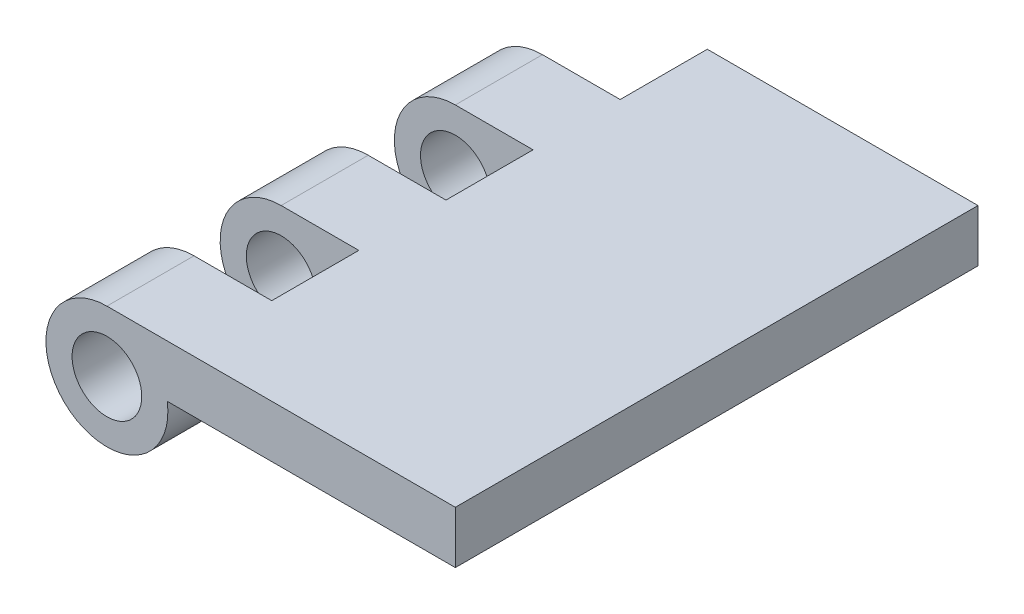
ISO-10303-21;
HEADER;
FILE_DESCRIPTION(('STEP AP214'),'2;1');
FILE_NAME('part.step','',(''),(''),'','','');
FILE_SCHEMA(('AUTOMOTIVE_DESIGN { 1 0 10303 214 1 1 1 1 }'));
ENDSEC;
DATA;
#1=APPLICATION_CONTEXT('core data for automotive mechanical design processes');
#2=APPLICATION_PROTOCOL_DEFINITION('international standard','automotive_design',2000,#1);
#3=PRODUCT_CONTEXT('',#1,'mechanical');
#4=PRODUCT('Part','Part','',(#3));
#5=PRODUCT_RELATED_PRODUCT_CATEGORY('part','',(#4));
#6=PRODUCT_DEFINITION_FORMATION('','',#4);
#7=PRODUCT_DEFINITION_CONTEXT('part definition',#1,'design');
#8=PRODUCT_DEFINITION('design','',#6,#7);
#9=PRODUCT_DEFINITION_SHAPE('','',#8);
#10=(LENGTH_UNIT() NAMED_UNIT(*) SI_UNIT(.MILLI.,.METRE.));
#11=(NAMED_UNIT(*) PLANE_ANGLE_UNIT() SI_UNIT($,.RADIAN.));
#12=(NAMED_UNIT(*) SI_UNIT($,.STERADIAN.) SOLID_ANGLE_UNIT());
#13=UNCERTAINTY_MEASURE_WITH_UNIT(LENGTH_MEASURE(1.E-05),#10,'distance_accuracy_value','');
#14=(GEOMETRIC_REPRESENTATION_CONTEXT(3) GLOBAL_UNCERTAINTY_ASSIGNED_CONTEXT((#13)) GLOBAL_UNIT_ASSIGNED_CONTEXT((#10,
#11,#12)) REPRESENTATION_CONTEXT('',''));
#15=CARTESIAN_POINT('',(0.,0.,0.));
#16=DIRECTION('',(0.,0.,1.));
#17=DIRECTION('',(1.,0.,0.));
#18=AXIS2_PLACEMENT_3D('',#15,#16,#17);
#19=CARTESIAN_POINT('',(0.,-7.,-45.));
#20=DIRECTION('',(0.,0.,-1.));
#21=DIRECTION('',(1.,0.,0.));
#22=AXIS2_PLACEMENT_3D('',#19,#20,#21);
#23=PLANE('',#22);
#24=DIRECTION('',(-1.,0.,0.));
#25=VECTOR('',#24,1.);
#26=CARTESIAN_POINT('',(20.,-6.5,-45.));
#27=LINE('',#26,#25);
#28=CARTESIAN_POINT('',(20.,-6.5,-45.));
#29=VERTEX_POINT('',#28);
#30=CARTESIAN_POINT('',(4.46063240110859,-6.5,-45.));
#31=VERTEX_POINT('',#30);
#32=EDGE_CURVE('E248',#29,#31,#27,.T.);
#33=ORIENTED_EDGE('',*,*,#32,.T.);
#34=DIRECTION('',(0.,1.,0.));
#35=VECTOR('',#34,1.);
#36=CARTESIAN_POINT('',(4.46063240110859,-7.,-45.));
#37=LINE('',#36,#35);
#38=CARTESIAN_POINT('',(4.46063240110859,-3.5,-45.));
#39=VERTEX_POINT('',#38);
#40=EDGE_CURVE('E227',#31,#39,#37,.T.);
#41=ORIENTED_EDGE('',*,*,#40,.T.);
#42=DIRECTION('',(1.,0.,0.));
#43=VECTOR('',#42,1.);
#44=CARTESIAN_POINT('',(0.,-3.5,-45.));
#45=LINE('',#44,#43);
#46=CARTESIAN_POINT('',(20.,-3.5,-45.));
#47=VERTEX_POINT('',#46);
#48=EDGE_CURVE('E239',#39,#47,#45,.T.);
#49=ORIENTED_EDGE('',*,*,#48,.T.);
#50=DIRECTION('',(0.,-1.,0.));
#51=VECTOR('',#50,1.);
#52=CARTESIAN_POINT('',(20.,-3.5,-45.));
#53=LINE('',#52,#51);
#54=EDGE_CURVE('E243',#47,#29,#53,.T.);
#55=ORIENTED_EDGE('',*,*,#54,.T.);
#56=EDGE_LOOP('',(#33,#41,#49,#55));
#57=FACE_BOUND('',#56,.T.);
#58=ADVANCED_FACE('F42',(#57),#23,.T.);
#59=CARTESIAN_POINT('',(0.,-7.,-45.));
#60=DIRECTION('',(0.,0.,1.));
#61=DIRECTION('',(-1.,0.,0.));
#62=AXIS2_PLACEMENT_3D('',#59,#60,#61);
#63=CYLINDRICAL_SURFACE('',#62,3.5);
#64=CARTESIAN_POINT('',(0.,-7.,-40.));
#65=DIRECTION('',(0.,0.,-1.));
#66=DIRECTION('',(1.,0.,0.));
#67=AXIS2_PLACEMENT_3D('',#64,#65,#66);
#68=CIRCLE('',#67,3.5);
#69=CARTESIAN_POINT('',(3.46410161513775,-6.5,-40.));
#70=VERTEX_POINT('',#69);
#71=CARTESIAN_POINT('',(0.,-3.5,-40.));
#72=VERTEX_POINT('',#71);
#73=EDGE_CURVE('E217',#70,#72,#68,.T.);
#74=ORIENTED_EDGE('',*,*,#73,.F.);
#75=DIRECTION('',(0.,0.,1.));
#76=VECTOR('',#75,1.);
#77=CARTESIAN_POINT('',(3.46410161513775,-6.5,-45.));
#78=LINE('',#77,#76);
#79=CARTESIAN_POINT('',(3.46410161513775,-6.5,-35.));
#80=VERTEX_POINT('',#79);
#81=EDGE_CURVE('E269',#70,#80,#78,.T.);
#82=ORIENTED_EDGE('',*,*,#81,.T.);
#83=CARTESIAN_POINT('',(0.,-7.,-35.));
#84=DIRECTION('',(0.,0.,-1.));
#85=DIRECTION('',(1.,0.,0.));
#86=AXIS2_PLACEMENT_3D('',#83,#84,#85);
#87=CIRCLE('',#86,3.5);
#88=CARTESIAN_POINT('',(0.,-3.5,-35.));
#89=VERTEX_POINT('',#88);
#90=EDGE_CURVE('E193',#80,#89,#87,.T.);
#91=ORIENTED_EDGE('',*,*,#90,.T.);
#92=DIRECTION('',(0.,0.,1.));
#93=VECTOR('',#92,1.);
#94=CARTESIAN_POINT('',(0.,-3.5,-45.));
#95=LINE('',#94,#93);
#96=EDGE_CURVE('E282',#72,#89,#95,.T.);
#97=ORIENTED_EDGE('',*,*,#96,.F.);
#98=EDGE_LOOP('',(#74,#82,#91,#97));
#99=FACE_BOUND('',#98,.T.);
#100=ADVANCED_FACE('F44',(#99),#63,.T.);
#101=CARTESIAN_POINT('',(0.,-7.,-30.));
#102=DIRECTION('',(0.,0.,-1.));
#103=DIRECTION('',(1.,0.,0.));
#104=AXIS2_PLACEMENT_3D('',#101,#102,#103);
#105=CIRCLE('',#104,3.5);
#106=CARTESIAN_POINT('',(3.46410161513775,-6.5,-30.));
#107=VERTEX_POINT('',#106);
#108=CARTESIAN_POINT('',(0.,-3.5,-30.));
#109=VERTEX_POINT('',#108);
#110=EDGE_CURVE('E205',#107,#109,#105,.T.);
#111=ORIENTED_EDGE('',*,*,#110,.F.);
#112=CARTESIAN_POINT('',(3.46410161513775,-6.5,-25.));
#113=VERTEX_POINT('',#112);
#114=EDGE_CURVE('E268',#107,#113,#78,.T.);
#115=ORIENTED_EDGE('',*,*,#114,.T.);
#116=CARTESIAN_POINT('',(0.,-7.,-25.));
#117=DIRECTION('',(0.,0.,-1.));
#118=DIRECTION('',(1.,0.,0.));
#119=AXIS2_PLACEMENT_3D('',#116,#117,#118);
#120=CIRCLE('',#119,3.5);
#121=CARTESIAN_POINT('',(0.,-3.5,-25.));
#122=VERTEX_POINT('',#121);
#123=EDGE_CURVE('E170',#113,#122,#120,.T.);
#124=ORIENTED_EDGE('',*,*,#123,.T.);
#125=EDGE_CURVE('E166',#109,#122,#95,.T.);
#126=ORIENTED_EDGE('',*,*,#125,.F.);
#127=EDGE_LOOP('',(#111,#115,#124,#126));
#128=FACE_BOUND('',#127,.T.);
#129=ADVANCED_FACE('F339',(#128),#63,.T.);
#130=CARTESIAN_POINT('',(0.,-7.,-20.));
#131=DIRECTION('',(0.,0.,-1.));
#132=DIRECTION('',(1.,0.,0.));
#133=AXIS2_PLACEMENT_3D('',#130,#131,#132);
#134=CIRCLE('',#133,3.5);
#135=CARTESIAN_POINT('',(3.46410161513775,-6.5,-20.));
#136=VERTEX_POINT('',#135);
#137=CARTESIAN_POINT('',(0.,-3.5,-20.));
#138=VERTEX_POINT('',#137);
#139=EDGE_CURVE('E182',#136,#138,#134,.T.);
#140=ORIENTED_EDGE('',*,*,#139,.F.);
#141=CARTESIAN_POINT('',(3.46410161513775,-6.5,-15.));
#142=VERTEX_POINT('',#141);
#143=EDGE_CURVE('E252',#136,#142,#78,.T.);
#144=ORIENTED_EDGE('',*,*,#143,.T.);
#145=CARTESIAN_POINT('',(0.,-7.,-15.));
#146=DIRECTION('',(0.,0.,-1.));
#147=DIRECTION('',(1.,0.,0.));
#148=AXIS2_PLACEMENT_3D('',#145,#146,#147);
#149=CIRCLE('',#148,3.5);
#150=CARTESIAN_POINT('',(0.,-3.5,-15.));
#151=VERTEX_POINT('',#150);
#152=EDGE_CURVE('E238',#142,#151,#149,.T.);
#153=ORIENTED_EDGE('',*,*,#152,.T.);
#154=EDGE_CURVE('E278',#138,#151,#95,.T.);
#155=ORIENTED_EDGE('',*,*,#154,.F.);
#156=EDGE_LOOP('',(#140,#144,#153,#155));
#157=FACE_BOUND('',#156,.T.);
#158=ADVANCED_FACE('F341',(#157),#63,.T.);
#159=CARTESIAN_POINT('',(0.,-3.5,-45.));
#160=DIRECTION('',(0.,-1.,0.));
#161=DIRECTION('',(0.,0.,-1.));
#162=AXIS2_PLACEMENT_3D('',#159,#160,#161);
#163=PLANE('',#162);
#164=DIRECTION('',(1.,0.,0.));
#165=VECTOR('',#164,1.);
#166=CARTESIAN_POINT('',(0.,-3.5,-40.));
#167=LINE('',#166,#165);
#168=CARTESIAN_POINT('',(4.46063240110859,-3.5,-40.));
#169=VERTEX_POINT('',#168);
#170=EDGE_CURVE('E162',#72,#169,#167,.T.);
#171=ORIENTED_EDGE('',*,*,#170,.F.);
#172=ORIENTED_EDGE('',*,*,#96,.T.);
#173=DIRECTION('',(1.,0.,0.));
#174=VECTOR('',#173,1.);
#175=CARTESIAN_POINT('',(0.,-3.5,-35.));
#176=LINE('',#175,#174);
#177=CARTESIAN_POINT('',(4.46063240110859,-3.5,-35.));
#178=VERTEX_POINT('',#177);
#179=EDGE_CURVE('E197',#89,#178,#176,.T.);
#180=ORIENTED_EDGE('',*,*,#179,.T.);
#181=DIRECTION('',(0.,0.,-1.));
#182=VECTOR('',#181,1.);
#183=CARTESIAN_POINT('',(4.46063240110859,-3.5,-45.));
#184=LINE('',#183,#182);
#185=CARTESIAN_POINT('',(4.46063240110859,-3.5,-30.));
#186=VERTEX_POINT('',#185);
#187=EDGE_CURVE('E161',#186,#178,#184,.T.);
#188=ORIENTED_EDGE('',*,*,#187,.F.);
#189=DIRECTION('',(1.,0.,0.));
#190=VECTOR('',#189,1.);
#191=CARTESIAN_POINT('',(0.,-3.5,-30.));
#192=LINE('',#191,#190);
#193=EDGE_CURVE('E209',#109,#186,#192,.T.);
#194=ORIENTED_EDGE('',*,*,#193,.F.);
#195=ORIENTED_EDGE('',*,*,#125,.T.);
#196=DIRECTION('',(1.,0.,0.));
#197=VECTOR('',#196,1.);
#198=CARTESIAN_POINT('',(0.,-3.5,-25.));
#199=LINE('',#198,#197);
#200=CARTESIAN_POINT('',(4.46063240110859,-3.5,-25.));
#201=VERTEX_POINT('',#200);
#202=EDGE_CURVE('E147',#122,#201,#199,.T.);
#203=ORIENTED_EDGE('',*,*,#202,.T.);
#204=DIRECTION('',(0.,0.,-1.));
#205=VECTOR('',#204,1.);
#206=CARTESIAN_POINT('',(4.46063240110859,-3.5,-45.));
#207=LINE('',#206,#205);
#208=CARTESIAN_POINT('',(4.46063240110859,-3.5,-20.));
#209=VERTEX_POINT('',#208);
#210=EDGE_CURVE('E156',#209,#201,#207,.T.);
#211=ORIENTED_EDGE('',*,*,#210,.F.);
#212=DIRECTION('',(1.,0.,0.));
#213=VECTOR('',#212,1.);
#214=CARTESIAN_POINT('',(0.,-3.5,-20.));
#215=LINE('',#214,#213);
#216=EDGE_CURVE('E186',#138,#209,#215,.T.);
#217=ORIENTED_EDGE('',*,*,#216,.F.);
#218=ORIENTED_EDGE('',*,*,#154,.T.);
#219=DIRECTION('',(1.,0.,0.));
#220=VECTOR('',#219,1.);
#221=CARTESIAN_POINT('',(0.,-3.5,-15.));
#222=LINE('',#221,#220);
#223=CARTESIAN_POINT('',(20.,-3.5,-15.));
#224=VERTEX_POINT('',#223);
#225=EDGE_CURVE('E256',#151,#224,#222,.T.);
#226=ORIENTED_EDGE('',*,*,#225,.T.);
#227=DIRECTION('',(0.,0.,1.));
#228=VECTOR('',#227,1.);
#229=CARTESIAN_POINT('',(20.,-3.5,-45.));
#230=LINE('',#229,#228);
#231=EDGE_CURVE('E274',#47,#224,#230,.T.);
#232=ORIENTED_EDGE('',*,*,#231,.F.);
#233=ORIENTED_EDGE('',*,*,#48,.F.);
#234=DIRECTION('',(0.,0.,-1.));
#235=VECTOR('',#234,1.);
#236=CARTESIAN_POINT('',(4.46063240110859,-3.5,-45.));
#237=LINE('',#236,#235);
#238=EDGE_CURVE('E231',#169,#39,#237,.T.);
#239=ORIENTED_EDGE('',*,*,#238,.F.);
#240=EDGE_LOOP('',(#171,#172,#180,#188,#194,#195,#203,#211,#217,#218,#226,#232,#233,#239));
#241=FACE_BOUND('',#240,.T.);
#242=ADVANCED_FACE('F164',(#241),#163,.F.);
#243=CARTESIAN_POINT('',(20.,-6.5,-45.));
#244=DIRECTION('',(0.,1.,0.));
#245=DIRECTION('',(1.,0.,0.));
#246=AXIS2_PLACEMENT_3D('',#243,#244,#245);
#247=PLANE('',#246);
#248=DIRECTION('',(-1.,0.,0.));
#249=VECTOR('',#248,1.);
#250=CARTESIAN_POINT('',(20.,-6.5,-40.));
#251=LINE('',#250,#249);
#252=CARTESIAN_POINT('',(4.46063240110859,-6.5,-40.));
#253=VERTEX_POINT('',#252);
#254=EDGE_CURVE('E214',#253,#70,#251,.T.);
#255=ORIENTED_EDGE('',*,*,#254,.F.);
#256=DIRECTION('',(0.,0.,1.));
#257=VECTOR('',#256,1.);
#258=CARTESIAN_POINT('',(4.46063240110859,-6.5,-45.));
#259=LINE('',#258,#257);
#260=EDGE_CURVE('E11',#31,#253,#259,.T.);
#261=ORIENTED_EDGE('',*,*,#260,.F.);
#262=ORIENTED_EDGE('',*,*,#32,.F.);
#263=DIRECTION('',(0.,0.,1.));
#264=VECTOR('',#263,1.);
#265=CARTESIAN_POINT('',(20.,-6.5,-45.));
#266=LINE('',#265,#264);
#267=CARTESIAN_POINT('',(20.,-6.5,-15.));
#268=VERTEX_POINT('',#267);
#269=EDGE_CURVE('E270',#29,#268,#266,.T.);
#270=ORIENTED_EDGE('',*,*,#269,.T.);
#271=DIRECTION('',(-1.,0.,0.));
#272=VECTOR('',#271,1.);
#273=CARTESIAN_POINT('',(20.,-6.5,-15.));
#274=LINE('',#273,#272);
#275=EDGE_CURVE('E244',#268,#142,#274,.T.);
#276=ORIENTED_EDGE('',*,*,#275,.T.);
#277=ORIENTED_EDGE('',*,*,#143,.F.);
#278=DIRECTION('',(-1.,0.,0.));
#279=VECTOR('',#278,1.);
#280=CARTESIAN_POINT('',(20.,-6.5,-20.));
#281=LINE('',#280,#279);
#282=CARTESIAN_POINT('',(4.46063240110859,-6.5,-20.));
#283=VERTEX_POINT('',#282);
#284=EDGE_CURVE('E175',#283,#136,#281,.T.);
#285=ORIENTED_EDGE('',*,*,#284,.F.);
#286=DIRECTION('',(0.,0.,1.));
#287=VECTOR('',#286,1.);
#288=CARTESIAN_POINT('',(4.46063240110859,-6.5,-45.));
#289=LINE('',#288,#287);
#290=CARTESIAN_POINT('',(4.46063240110859,-6.5,-25.));
#291=VERTEX_POINT('',#290);
#292=EDGE_CURVE('E297',#291,#283,#289,.T.);
#293=ORIENTED_EDGE('',*,*,#292,.F.);
#294=DIRECTION('',(-1.,0.,0.));
#295=VECTOR('',#294,1.);
#296=CARTESIAN_POINT('',(20.,-6.5,-25.));
#297=LINE('',#296,#295);
#298=EDGE_CURVE('E63',#291,#113,#297,.T.);
#299=ORIENTED_EDGE('',*,*,#298,.T.);
#300=ORIENTED_EDGE('',*,*,#114,.F.);
#301=DIRECTION('',(-1.,0.,0.));
#302=VECTOR('',#301,1.);
#303=CARTESIAN_POINT('',(20.,-6.5,-30.));
#304=LINE('',#303,#302);
#305=CARTESIAN_POINT('',(4.46063240110859,-6.5,-30.));
#306=VERTEX_POINT('',#305);
#307=EDGE_CURVE('E202',#306,#107,#304,.T.);
#308=ORIENTED_EDGE('',*,*,#307,.F.);
#309=DIRECTION('',(0.,0.,1.));
#310=VECTOR('',#309,1.);
#311=CARTESIAN_POINT('',(4.46063240110859,-6.5,-45.));
#312=LINE('',#311,#310);
#313=CARTESIAN_POINT('',(4.46063240110859,-6.5,-35.));
#314=VERTEX_POINT('',#313);
#315=EDGE_CURVE('E51',#314,#306,#312,.T.);
#316=ORIENTED_EDGE('',*,*,#315,.F.);
#317=DIRECTION('',(-1.,0.,0.));
#318=VECTOR('',#317,1.);
#319=CARTESIAN_POINT('',(20.,-6.5,-35.));
#320=LINE('',#319,#318);
#321=EDGE_CURVE('E190',#314,#80,#320,.T.);
#322=ORIENTED_EDGE('',*,*,#321,.T.);
#323=ORIENTED_EDGE('',*,*,#81,.F.);
#324=EDGE_LOOP('',(#255,#261,#262,#270,#276,#277,#285,#293,#299,#300,#308,#316,#322,#323));
#325=FACE_BOUND('',#324,.T.);
#326=ADVANCED_FACE('F307',(#325),#247,.F.);
#327=CARTESIAN_POINT('',(0.,-7.,-45.));
#328=DIRECTION('',(0.,0.,1.));
#329=DIRECTION('',(-1.,0.,0.));
#330=AXIS2_PLACEMENT_3D('',#327,#328,#329);
#331=CYLINDRICAL_SURFACE('',#330,2.);
#332=CARTESIAN_POINT('',(0.,-7.,-15.));
#333=DIRECTION('',(0.,0.,-1.));
#334=DIRECTION('',(1.,0.,0.));
#335=AXIS2_PLACEMENT_3D('',#332,#333,#334);
#336=CIRCLE('',#335,2.);
#337=CARTESIAN_POINT('',(2.,-7.,-15.));
#338=VERTEX_POINT('',#337);
#339=EDGE_CURVE('E234',#338,#338,#336,.T.);
#340=ORIENTED_EDGE('',*,*,#339,.F.);
#341=EDGE_LOOP('',(#340));
#342=FACE_BOUND('',#341,.T.);
#343=CARTESIAN_POINT('',(0.,-7.,-20.));
#344=DIRECTION('',(0.,0.,-1.));
#345=DIRECTION('',(1.,0.,0.));
#346=AXIS2_PLACEMENT_3D('',#343,#344,#345);
#347=CIRCLE('',#346,2.);
#348=CARTESIAN_POINT('',(2.,-7.,-20.));
#349=VERTEX_POINT('',#348);
#350=EDGE_CURVE('E169',#349,#349,#347,.T.);
#351=ORIENTED_EDGE('',*,*,#350,.T.);
#352=EDGE_LOOP('',(#351));
#353=FACE_BOUND('',#352,.T.);
#354=ADVANCED_FACE('F360',(#342,#353),#331,.F.);
#355=CARTESIAN_POINT('',(0.,-7.,-15.));
#356=DIRECTION('',(0.,0.,-1.));
#357=DIRECTION('',(1.,0.,0.));
#358=AXIS2_PLACEMENT_3D('',#355,#356,#357);
#359=PLANE('',#358);
#360=ORIENTED_EDGE('',*,*,#152,.F.);
#361=ORIENTED_EDGE('',*,*,#275,.F.);
#362=DIRECTION('',(0.,-1.,0.));
#363=VECTOR('',#362,1.);
#364=CARTESIAN_POINT('',(20.,-3.5,-15.));
#365=LINE('',#364,#363);
#366=EDGE_CURVE('E260',#224,#268,#365,.T.);
#367=ORIENTED_EDGE('',*,*,#366,.F.);
#368=ORIENTED_EDGE('',*,*,#225,.F.);
#369=EDGE_LOOP('',(#360,#361,#367,#368));
#370=FACE_BOUND('',#369,.T.);
#371=ORIENTED_EDGE('',*,*,#339,.T.);
#372=EDGE_LOOP('',(#371));
#373=FACE_BOUND('',#372,.T.);
#374=ADVANCED_FACE('F356',(#370,#373),#359,.F.);
#375=CARTESIAN_POINT('',(20.,-3.5,-45.));
#376=DIRECTION('',(-1.,0.,0.));
#377=DIRECTION('',(0.,0.,-1.));
#378=AXIS2_PLACEMENT_3D('',#375,#376,#377);
#379=PLANE('',#378);
#380=ORIENTED_EDGE('',*,*,#366,.T.);
#381=ORIENTED_EDGE('',*,*,#269,.F.);
#382=ORIENTED_EDGE('',*,*,#54,.F.);
#383=ORIENTED_EDGE('',*,*,#231,.T.);
#384=EDGE_LOOP('',(#380,#381,#382,#383));
#385=FACE_BOUND('',#384,.T.);
#386=ADVANCED_FACE('F359',(#385),#379,.F.);
#387=CARTESIAN_POINT('',(4.46063240110859,8.00000000000001,-20.));
#388=DIRECTION('',(-1.,0.,0.));
#389=DIRECTION('',(0.,0.,-1.));
#390=AXIS2_PLACEMENT_3D('',#387,#388,#389);
#391=PLANE('',#390);
#392=ORIENTED_EDGE('',*,*,#210,.T.);
#393=DIRECTION('',(0.,-1.,0.));
#394=VECTOR('',#393,1.);
#395=CARTESIAN_POINT('',(4.46063240110859,8.00000000000001,-25.));
#396=LINE('',#395,#394);
#397=EDGE_CURVE('E143',#201,#291,#396,.T.);
#398=ORIENTED_EDGE('',*,*,#397,.T.);
#399=ORIENTED_EDGE('',*,*,#292,.T.);
#400=DIRECTION('',(0.,-1.,0.));
#401=VECTOR('',#400,1.);
#402=CARTESIAN_POINT('',(4.46063240110859,8.00000000000001,-20.));
#403=LINE('',#402,#401);
#404=EDGE_CURVE('E153',#209,#283,#403,.T.);
#405=ORIENTED_EDGE('',*,*,#404,.F.);
#406=EDGE_LOOP('',(#392,#398,#399,#405));
#407=FACE_BOUND('',#406,.T.);
#408=ADVANCED_FACE('F157',(#407),#391,.T.);
#409=CARTESIAN_POINT('',(-6.78653313177124,8.00000000000001,-20.));
#410=DIRECTION('',(0.,0.,-1.));
#411=DIRECTION('',(1.,0.,0.));
#412=AXIS2_PLACEMENT_3D('',#409,#410,#411);
#413=PLANE('',#412);
#414=ORIENTED_EDGE('',*,*,#350,.F.);
#415=EDGE_LOOP('',(#414));
#416=FACE_BOUND('',#415,.T.);
#417=ORIENTED_EDGE('',*,*,#216,.T.);
#418=ORIENTED_EDGE('',*,*,#404,.T.);
#419=ORIENTED_EDGE('',*,*,#284,.T.);
#420=ORIENTED_EDGE('',*,*,#139,.T.);
#421=EDGE_LOOP('',(#417,#418,#419,#420));
#422=FACE_BOUND('',#421,.T.);
#423=ADVANCED_FACE('F396',(#416,#422),#413,.T.);
#424=CARTESIAN_POINT('',(-6.78653313177124,8.00000000000001,-25.));
#425=DIRECTION('',(0.,0.,-1.));
#426=DIRECTION('',(1.,0.,0.));
#427=AXIS2_PLACEMENT_3D('',#424,#425,#426);
#428=PLANE('',#427);
#429=CARTESIAN_POINT('',(0.,-7.,-25.));
#430=DIRECTION('',(0.,0.,-1.));
#431=DIRECTION('',(1.,0.,0.));
#432=AXIS2_PLACEMENT_3D('',#429,#430,#431);
#433=CIRCLE('',#432,2.);
#434=CARTESIAN_POINT('',(2.,-7.,-25.));
#435=VERTEX_POINT('',#434);
#436=EDGE_CURVE('E283',#435,#435,#433,.T.);
#437=ORIENTED_EDGE('',*,*,#436,.T.);
#438=EDGE_LOOP('',(#437));
#439=FACE_BOUND('',#438,.T.);
#440=ORIENTED_EDGE('',*,*,#123,.F.);
#441=ORIENTED_EDGE('',*,*,#298,.F.);
#442=ORIENTED_EDGE('',*,*,#397,.F.);
#443=ORIENTED_EDGE('',*,*,#202,.F.);
#444=EDGE_LOOP('',(#440,#441,#442,#443));
#445=FACE_BOUND('',#444,.T.);
#446=ADVANCED_FACE('F145',(#439,#445),#428,.F.);
#447=CARTESIAN_POINT('',(4.46063240110859,8.00000000000001,-30.));
#448=DIRECTION('',(-1.,0.,0.));
#449=DIRECTION('',(0.,0.,-1.));
#450=AXIS2_PLACEMENT_3D('',#447,#448,#449);
#451=PLANE('',#450);
#452=ORIENTED_EDGE('',*,*,#187,.T.);
#453=DIRECTION('',(0.,-1.,0.));
#454=VECTOR('',#453,1.);
#455=CARTESIAN_POINT('',(4.46063240110859,8.00000000000001,-35.));
#456=LINE('',#455,#454);
#457=EDGE_CURVE('E305',#178,#314,#456,.T.);
#458=ORIENTED_EDGE('',*,*,#457,.T.);
#459=ORIENTED_EDGE('',*,*,#315,.T.);
#460=DIRECTION('',(0.,-1.,0.));
#461=VECTOR('',#460,1.);
#462=CARTESIAN_POINT('',(4.46063240110859,8.00000000000001,-30.));
#463=LINE('',#462,#461);
#464=EDGE_CURVE('E152',#186,#306,#463,.T.);
#465=ORIENTED_EDGE('',*,*,#464,.F.);
#466=EDGE_LOOP('',(#452,#458,#459,#465));
#467=FACE_BOUND('',#466,.T.);
#468=ADVANCED_FACE('F304',(#467),#451,.T.);
#469=CARTESIAN_POINT('',(-6.78653313177124,8.00000000000001,-30.));
#470=DIRECTION('',(0.,0.,-1.));
#471=DIRECTION('',(1.,0.,0.));
#472=AXIS2_PLACEMENT_3D('',#469,#470,#471);
#473=PLANE('',#472);
#474=CARTESIAN_POINT('',(0.,-7.,-30.));
#475=DIRECTION('',(0.,0.,-1.));
#476=DIRECTION('',(1.,0.,0.));
#477=AXIS2_PLACEMENT_3D('',#474,#475,#476);
#478=CIRCLE('',#477,2.);
#479=CARTESIAN_POINT('',(2.,-7.,-30.));
#480=VERTEX_POINT('',#479);
#481=EDGE_CURVE('E201',#480,#480,#478,.T.);
#482=ORIENTED_EDGE('',*,*,#481,.F.);
#483=EDGE_LOOP('',(#482));
#484=FACE_BOUND('',#483,.T.);
#485=ORIENTED_EDGE('',*,*,#193,.T.);
#486=ORIENTED_EDGE('',*,*,#464,.T.);
#487=ORIENTED_EDGE('',*,*,#307,.T.);
#488=ORIENTED_EDGE('',*,*,#110,.T.);
#489=EDGE_LOOP('',(#485,#486,#487,#488));
#490=FACE_BOUND('',#489,.T.);
#491=ADVANCED_FACE('F311',(#484,#490),#473,.T.);
#492=CARTESIAN_POINT('',(-6.78653313177124,8.00000000000001,-35.));
#493=DIRECTION('',(0.,0.,-1.));
#494=DIRECTION('',(1.,0.,0.));
#495=AXIS2_PLACEMENT_3D('',#492,#493,#494);
#496=PLANE('',#495);
#497=CARTESIAN_POINT('',(0.,-7.,-35.));
#498=DIRECTION('',(0.,0.,-1.));
#499=DIRECTION('',(1.,0.,0.));
#500=AXIS2_PLACEMENT_3D('',#497,#498,#499);
#501=CIRCLE('',#500,2.);
#502=CARTESIAN_POINT('',(2.,-7.,-35.));
#503=VERTEX_POINT('',#502);
#504=EDGE_CURVE('E189',#503,#503,#501,.T.);
#505=ORIENTED_EDGE('',*,*,#504,.T.);
#506=EDGE_LOOP('',(#505));
#507=FACE_BOUND('',#506,.T.);
#508=ORIENTED_EDGE('',*,*,#90,.F.);
#509=ORIENTED_EDGE('',*,*,#321,.F.);
#510=ORIENTED_EDGE('',*,*,#457,.F.);
#511=ORIENTED_EDGE('',*,*,#179,.F.);
#512=EDGE_LOOP('',(#508,#509,#510,#511));
#513=FACE_BOUND('',#512,.T.);
#514=ADVANCED_FACE('F422',(#507,#513),#496,.F.);
#515=CARTESIAN_POINT('',(4.46063240110859,8.00000000000001,-40.));
#516=DIRECTION('',(-1.,0.,0.));
#517=DIRECTION('',(0.,0.,-1.));
#518=AXIS2_PLACEMENT_3D('',#515,#516,#517);
#519=PLANE('',#518);
#520=ORIENTED_EDGE('',*,*,#238,.T.);
#521=ORIENTED_EDGE('',*,*,#40,.F.);
#522=ORIENTED_EDGE('',*,*,#260,.T.);
#523=DIRECTION('',(0.,-1.,0.));
#524=VECTOR('',#523,1.);
#525=CARTESIAN_POINT('',(4.46063240110859,8.00000000000001,-40.));
#526=LINE('',#525,#524);
#527=EDGE_CURVE('E286',#169,#253,#526,.T.);
#528=ORIENTED_EDGE('',*,*,#527,.F.);
#529=EDGE_LOOP('',(#520,#521,#522,#528));
#530=FACE_BOUND('',#529,.T.);
#531=ADVANCED_FACE('F327',(#530),#519,.T.);
#532=CARTESIAN_POINT('',(-8.56027966742254,8.00000000000001,-40.));
#533=DIRECTION('',(0.,0.,-1.));
#534=DIRECTION('',(1.,0.,0.));
#535=AXIS2_PLACEMENT_3D('',#532,#533,#534);
#536=PLANE('',#535);
#537=CARTESIAN_POINT('',(0.,-7.,-40.));
#538=DIRECTION('',(0.,0.,-1.));
#539=DIRECTION('',(1.,0.,0.));
#540=AXIS2_PLACEMENT_3D('',#537,#538,#539);
#541=CIRCLE('',#540,2.);
#542=CARTESIAN_POINT('',(2.,-7.,-40.));
#543=VERTEX_POINT('',#542);
#544=EDGE_CURVE('E213',#543,#543,#541,.T.);
#545=ORIENTED_EDGE('',*,*,#544,.F.);
#546=EDGE_LOOP('',(#545));
#547=FACE_BOUND('',#546,.T.);
#548=ORIENTED_EDGE('',*,*,#170,.T.);
#549=ORIENTED_EDGE('',*,*,#527,.T.);
#550=ORIENTED_EDGE('',*,*,#254,.T.);
#551=ORIENTED_EDGE('',*,*,#73,.T.);
#552=EDGE_LOOP('',(#548,#549,#550,#551));
#553=FACE_BOUND('',#552,.T.);
#554=ADVANCED_FACE('F323',(#547,#553),#536,.T.);
#555=ORIENTED_EDGE('',*,*,#436,.F.);
#556=EDGE_LOOP('',(#555));
#557=FACE_BOUND('',#556,.T.);
#558=ORIENTED_EDGE('',*,*,#481,.T.);
#559=EDGE_LOOP('',(#558));
#560=FACE_BOUND('',#559,.T.);
#561=ADVANCED_FACE('F381',(#557,#560),#331,.F.);
#562=ORIENTED_EDGE('',*,*,#504,.F.);
#563=EDGE_LOOP('',(#562));
#564=FACE_BOUND('',#563,.T.);
#565=ORIENTED_EDGE('',*,*,#544,.T.);
#566=EDGE_LOOP('',(#565));
#567=FACE_BOUND('',#566,.T.);
#568=ADVANCED_FACE('F354',(#564,#567),#331,.F.);
#569=CLOSED_SHELL('',(#58,#100,#129,#158,#242,#326,#354,#374,#386,#408,#423,#446,#468,#491,#514,
#531,#554,#561,#568));
#570=MANIFOLD_SOLID_BREP('B2',#569);
#571=ADVANCED_BREP_SHAPE_REPRESENTATION('',(#18,#570),#14);
#572=SHAPE_DEFINITION_REPRESENTATION(#9,#571);
ENDSEC;
END-ISO-10303-21;
